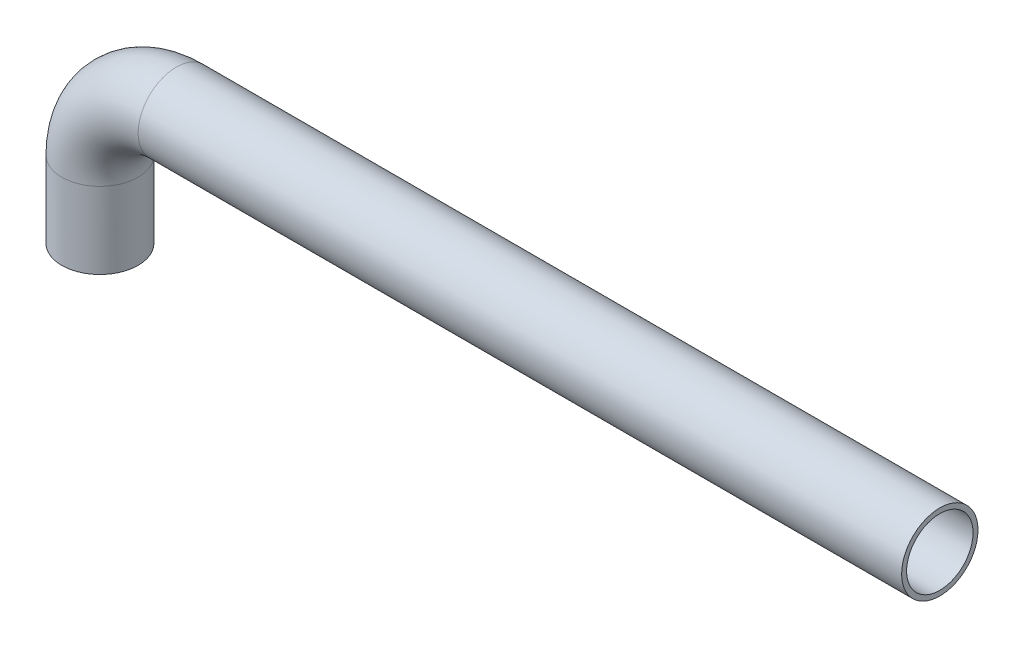
ISO-10303-21;
HEADER;
FILE_DESCRIPTION(('STEP AP214'),'2;1');
FILE_NAME('part.step','',(''),(''),'','','');
FILE_SCHEMA(('AUTOMOTIVE_DESIGN { 1 0 10303 214 1 1 1 1 }'));
ENDSEC;
DATA;
#1=APPLICATION_CONTEXT('core data for automotive mechanical design processes');
#2=APPLICATION_PROTOCOL_DEFINITION('international standard','automotive_design',2000,#1);
#3=PRODUCT_CONTEXT('',#1,'mechanical');
#4=PRODUCT('Part','Part','',(#3));
#5=PRODUCT_RELATED_PRODUCT_CATEGORY('part','',(#4));
#6=PRODUCT_DEFINITION_FORMATION('','',#4);
#7=PRODUCT_DEFINITION_CONTEXT('part definition',#1,'design');
#8=PRODUCT_DEFINITION('design','',#6,#7);
#9=PRODUCT_DEFINITION_SHAPE('','',#8);
#10=(LENGTH_UNIT() NAMED_UNIT(*) SI_UNIT(.MILLI.,.METRE.));
#11=(NAMED_UNIT(*) PLANE_ANGLE_UNIT() SI_UNIT($,.RADIAN.));
#12=(NAMED_UNIT(*) SI_UNIT($,.STERADIAN.) SOLID_ANGLE_UNIT());
#13=UNCERTAINTY_MEASURE_WITH_UNIT(LENGTH_MEASURE(1.E-05),#10,'distance_accuracy_value','');
#14=(GEOMETRIC_REPRESENTATION_CONTEXT(3) GLOBAL_UNCERTAINTY_ASSIGNED_CONTEXT((#13)) GLOBAL_UNIT_ASSIGNED_CONTEXT((#10,
#11,#12)) REPRESENTATION_CONTEXT('',''));
#15=CARTESIAN_POINT('',(0.,0.,0.));
#16=DIRECTION('',(0.,0.,1.));
#17=DIRECTION('',(1.,0.,0.));
#18=AXIS2_PLACEMENT_3D('',#15,#16,#17);
#19=CARTESIAN_POINT('',(127.,0.,0.));
#20=DIRECTION('',(1.,0.,0.));
#21=DIRECTION('',(0.,0.,-1.));
#22=AXIS2_PLACEMENT_3D('',#19,#20,#21);
#23=PLANE('',#22);
#24=CARTESIAN_POINT('',(127.,0.,0.));
#25=DIRECTION('',(1.,0.,0.));
#26=DIRECTION('',(0.,0.,-1.));
#27=AXIS2_PLACEMENT_3D('',#24,#25,#26);
#28=CIRCLE('',#27,12.7);
#29=CARTESIAN_POINT('',(127.,0.,-12.7));
#30=VERTEX_POINT('',#29);
#31=EDGE_CURVE('E10',#30,#30,#28,.T.);
#32=ORIENTED_EDGE('',*,*,#31,.T.);
#33=EDGE_LOOP('',(#32));
#34=FACE_BOUND('',#33,.T.);
#35=CARTESIAN_POINT('',(127.,0.,0.));
#36=DIRECTION('',(1.,0.,0.));
#37=DIRECTION('',(0.,0.,-1.));
#38=AXIS2_PLACEMENT_3D('',#35,#36,#37);
#39=CIRCLE('',#38,11.049);
#40=CARTESIAN_POINT('',(127.,0.,-11.049));
#41=VERTEX_POINT('',#40);
#42=EDGE_CURVE('E38',#41,#41,#39,.T.);
#43=ORIENTED_EDGE('',*,*,#42,.F.);
#44=EDGE_LOOP('',(#43));
#45=FACE_BOUND('',#44,.T.);
#46=ADVANCED_FACE('F31',(#34,#45),#23,.T.);
#47=CARTESIAN_POINT('',(127.,0.,0.));
#48=DIRECTION('',(-1.,0.,0.));
#49=DIRECTION('',(0.,0.,1.));
#50=AXIS2_PLACEMENT_3D('',#47,#48,#49);
#51=CYLINDRICAL_SURFACE('',#50,12.7);
#52=ORIENTED_EDGE('',*,*,#31,.F.);
#53=EDGE_LOOP('',(#52));
#54=FACE_BOUND('',#53,.T.);
#55=CARTESIAN_POINT('',(-127.,0.,0.));
#56=DIRECTION('',(-1.,0.,0.));
#57=DIRECTION('',(0.,0.,1.));
#58=AXIS2_PLACEMENT_3D('',#55,#56,#57);
#59=CIRCLE('',#58,12.7);
#60=CARTESIAN_POINT('',(-127.,12.7,0.));
#61=VERTEX_POINT('',#60);
#62=EDGE_CURVE('E52',#61,#61,#59,.T.);
#63=ORIENTED_EDGE('',*,*,#62,.F.);
#64=EDGE_LOOP('',(#63));
#65=FACE_BOUND('',#64,.T.);
#66=ADVANCED_FACE('F33',(#54,#65),#51,.T.);
#67=CARTESIAN_POINT('',(127.,0.,0.));
#68=DIRECTION('',(-1.,0.,0.));
#69=DIRECTION('',(0.,0.,1.));
#70=AXIS2_PLACEMENT_3D('',#67,#68,#69);
#71=CYLINDRICAL_SURFACE('',#70,11.049);
#72=ORIENTED_EDGE('',*,*,#42,.T.);
#73=EDGE_LOOP('',(#72));
#74=FACE_BOUND('',#73,.T.);
#75=CARTESIAN_POINT('',(-127.,0.,0.));
#76=DIRECTION('',(1.,0.,0.));
#77=DIRECTION('',(0.,0.,-1.));
#78=AXIS2_PLACEMENT_3D('',#75,#76,#77);
#79=CIRCLE('',#78,11.049);
#80=CARTESIAN_POINT('',(-127.,11.049,0.));
#81=VERTEX_POINT('',#80);
#82=EDGE_CURVE('E42',#81,#81,#79,.T.);
#83=ORIENTED_EDGE('',*,*,#82,.F.);
#84=EDGE_LOOP('',(#83));
#85=FACE_BOUND('',#84,.T.);
#86=ADVANCED_FACE('F73',(#74,#85),#71,.F.);
#87=CARTESIAN_POINT('',(-127.,-25.4,0.));
#88=DIRECTION('',(0.,0.,1.));
#89=DIRECTION('',(1.,0.,0.));
#90=AXIS2_PLACEMENT_3D('',#87,#88,#89);
#91=TOROIDAL_SURFACE('',#90,25.4,12.7);
#92=CARTESIAN_POINT('',(-152.4,-25.4,0.));
#93=DIRECTION('',(0.,-1.,0.));
#94=DIRECTION('',(0.,0.,1.));
#95=AXIS2_PLACEMENT_3D('',#92,#93,#94);
#96=CIRCLE('',#95,12.7);
#97=CARTESIAN_POINT('',(-165.1,-25.4,0.));
#98=VERTEX_POINT('',#97);
#99=EDGE_CURVE('E49',#98,#98,#96,.T.);
#100=CARTESIAN_POINT('',(-127.,-25.4,0.));
#101=DIRECTION('',(0.,0.,1.));
#102=DIRECTION('',(1.,0.,0.));
#103=AXIS2_PLACEMENT_3D('',#100,#101,#102);
#104=CIRCLE('',#103,38.1);
#105=EDGE_CURVE('',#61,#98,#104,.T.);
#106=ORIENTED_EDGE('',*,*,#62,.T.);
#107=ORIENTED_EDGE('',*,*,#99,.F.);
#108=ORIENTED_EDGE('',*,*,#105,.T.);
#109=ORIENTED_EDGE('',*,*,#105,.F.);
#110=EDGE_LOOP('',(#106,#108,#107,#109));
#111=FACE_BOUND('',#110,.T.);
#112=ADVANCED_FACE('F75',(#111),#91,.T.);
#113=CARTESIAN_POINT('',(-152.4,-25.4,0.));
#114=DIRECTION('',(0.,-1.,0.));
#115=DIRECTION('',(0.,0.,-1.));
#116=AXIS2_PLACEMENT_3D('',#113,#114,#115);
#117=CYLINDRICAL_SURFACE('',#116,12.7);
#118=CARTESIAN_POINT('',(-152.4,-50.8,0.));
#119=DIRECTION('',(0.,-1.,0.));
#120=DIRECTION('',(0.,0.,1.));
#121=AXIS2_PLACEMENT_3D('',#118,#119,#120);
#122=CIRCLE('',#121,12.7);
#123=CARTESIAN_POINT('',(-152.4,-50.8,12.7));
#124=VERTEX_POINT('',#123);
#125=EDGE_CURVE('E55',#124,#124,#122,.T.);
#126=ORIENTED_EDGE('',*,*,#125,.F.);
#127=EDGE_LOOP('',(#126));
#128=FACE_BOUND('',#127,.T.);
#129=ORIENTED_EDGE('',*,*,#99,.T.);
#130=EDGE_LOOP('',(#129));
#131=FACE_BOUND('',#130,.T.);
#132=ADVANCED_FACE('F81',(#128,#131),#117,.T.);
#133=CARTESIAN_POINT('',(-152.4,-50.8,0.));
#134=DIRECTION('',(0.,-1.,0.));
#135=DIRECTION('',(0.,0.,1.));
#136=AXIS2_PLACEMENT_3D('',#133,#134,#135);
#137=PLANE('',#136);
#138=CARTESIAN_POINT('',(-152.4,-50.8,0.));
#139=DIRECTION('',(0.,-1.,0.));
#140=DIRECTION('',(0.,0.,1.));
#141=AXIS2_PLACEMENT_3D('',#138,#139,#140);
#142=CIRCLE('',#141,11.049);
#143=CARTESIAN_POINT('',(-152.4,-50.8,11.049));
#144=VERTEX_POINT('',#143);
#145=EDGE_CURVE('E47',#144,#144,#142,.F.);
#146=ORIENTED_EDGE('',*,*,#145,.T.);
#147=EDGE_LOOP('',(#146));
#148=FACE_BOUND('',#147,.T.);
#149=ORIENTED_EDGE('',*,*,#125,.T.);
#150=EDGE_LOOP('',(#149));
#151=FACE_BOUND('',#150,.T.);
#152=ADVANCED_FACE('F69',(#148,#151),#137,.T.);
#153=CARTESIAN_POINT('',(-127.,-25.4,0.));
#154=DIRECTION('',(0.,0.,1.));
#155=DIRECTION('',(1.,0.,0.));
#156=AXIS2_PLACEMENT_3D('',#153,#154,#155);
#157=TOROIDAL_SURFACE('',#156,25.4,11.049);
#158=CARTESIAN_POINT('',(-152.4,-25.4,0.));
#159=DIRECTION('',(0.,-1.,0.));
#160=DIRECTION('',(0.,0.,1.));
#161=AXIS2_PLACEMENT_3D('',#158,#159,#160);
#162=CIRCLE('',#161,11.049);
#163=CARTESIAN_POINT('',(-163.449,-25.4,0.));
#164=VERTEX_POINT('',#163);
#165=EDGE_CURVE('E58',#164,#164,#162,.F.);
#166=CARTESIAN_POINT('',(-127.,-25.4,0.));
#167=DIRECTION('',(0.,0.,1.));
#168=DIRECTION('',(1.,0.,0.));
#169=AXIS2_PLACEMENT_3D('',#166,#167,#168);
#170=CIRCLE('',#169,36.449);
#171=EDGE_CURVE('',#81,#164,#170,.T.);
#172=ORIENTED_EDGE('',*,*,#82,.T.);
#173=ORIENTED_EDGE('',*,*,#165,.F.);
#174=ORIENTED_EDGE('',*,*,#171,.T.);
#175=ORIENTED_EDGE('',*,*,#171,.F.);
#176=EDGE_LOOP('',(#172,#174,#173,#175));
#177=FACE_BOUND('',#176,.T.);
#178=ADVANCED_FACE('F66',(#177),#157,.F.);
#179=CARTESIAN_POINT('',(-152.4,-25.4,0.));
#180=DIRECTION('',(0.,-1.,0.));
#181=DIRECTION('',(0.,0.,-1.));
#182=AXIS2_PLACEMENT_3D('',#179,#180,#181);
#183=CYLINDRICAL_SURFACE('',#182,11.049);
#184=ORIENTED_EDGE('',*,*,#145,.F.);
#185=EDGE_LOOP('',(#184));
#186=FACE_BOUND('',#185,.T.);
#187=ORIENTED_EDGE('',*,*,#165,.T.);
#188=EDGE_LOOP('',(#187));
#189=FACE_BOUND('',#188,.T.);
#190=ADVANCED_FACE('F64',(#186,#189),#183,.F.);
#191=CLOSED_SHELL('',(#46,#66,#86,#112,#132,#152,#178,#190));
#192=MANIFOLD_SOLID_BREP('B2',#191);
#193=ADVANCED_BREP_SHAPE_REPRESENTATION('',(#18,#192),#14);
#194=SHAPE_DEFINITION_REPRESENTATION(#9,#193);
ENDSEC;
END-ISO-10303-21;
